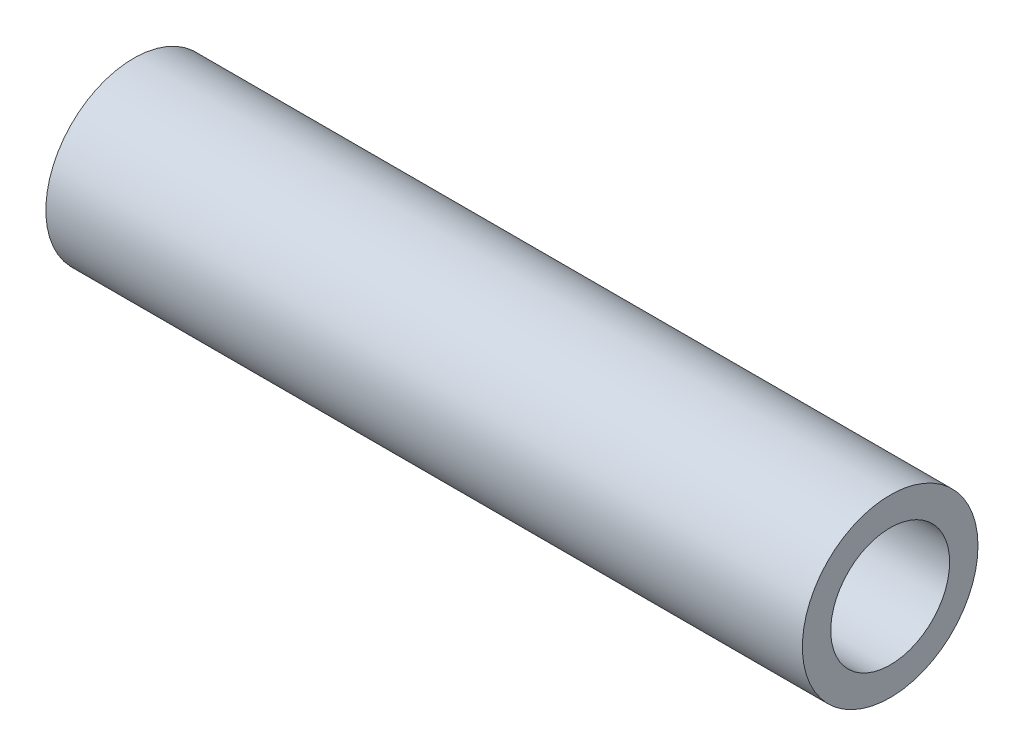
ISO-10303-21;
HEADER;
FILE_DESCRIPTION(('STEP AP214'),'2;1');
FILE_NAME('part.step','',(''),(''),'','','');
FILE_SCHEMA(('AUTOMOTIVE_DESIGN { 1 0 10303 214 1 1 1 1 }'));
ENDSEC;
DATA;
#1=APPLICATION_CONTEXT('core data for automotive mechanical design processes');
#2=APPLICATION_PROTOCOL_DEFINITION('international standard','automotive_design',2000,#1);
#3=PRODUCT_CONTEXT('',#1,'mechanical');
#4=PRODUCT('Part','Part','',(#3));
#5=PRODUCT_RELATED_PRODUCT_CATEGORY('part','',(#4));
#6=PRODUCT_DEFINITION_FORMATION('','',#4);
#7=PRODUCT_DEFINITION_CONTEXT('part definition',#1,'design');
#8=PRODUCT_DEFINITION('design','',#6,#7);
#9=PRODUCT_DEFINITION_SHAPE('','',#8);
#10=(LENGTH_UNIT() NAMED_UNIT(*) SI_UNIT(.MILLI.,.METRE.));
#11=(NAMED_UNIT(*) PLANE_ANGLE_UNIT() SI_UNIT($,.RADIAN.));
#12=(NAMED_UNIT(*) SI_UNIT($,.STERADIAN.) SOLID_ANGLE_UNIT());
#13=UNCERTAINTY_MEASURE_WITH_UNIT(LENGTH_MEASURE(1.E-05),#10,'distance_accuracy_value','');
#14=(GEOMETRIC_REPRESENTATION_CONTEXT(3) GLOBAL_UNCERTAINTY_ASSIGNED_CONTEXT((#13)) GLOBAL_UNIT_ASSIGNED_CONTEXT((#10,
#11,#12)) REPRESENTATION_CONTEXT('',''));
#15=CARTESIAN_POINT('',(0.,0.,0.));
#16=DIRECTION('',(0.,0.,1.));
#17=DIRECTION('',(1.,0.,0.));
#18=AXIS2_PLACEMENT_3D('',#15,#16,#17);
#19=CARTESIAN_POINT('',(28.,0.,0.));
#20=DIRECTION('',(1.,0.,0.));
#21=DIRECTION('',(0.,0.,-1.));
#22=AXIS2_PLACEMENT_3D('',#19,#20,#21);
#23=PLANE('',#22);
#24=CARTESIAN_POINT('',(28.,0.,0.));
#25=DIRECTION('',(1.,0.,0.));
#26=DIRECTION('',(0.,0.,-1.));
#27=AXIS2_PLACEMENT_3D('',#24,#25,#26);
#28=CIRCLE('',#27,3.25);
#29=CARTESIAN_POINT('',(28.,0.,-3.25));
#30=VERTEX_POINT('',#29);
#31=EDGE_CURVE('E10',#30,#30,#28,.T.);
#32=ORIENTED_EDGE('',*,*,#31,.T.);
#33=EDGE_LOOP('',(#32));
#34=FACE_BOUND('',#33,.T.);
#35=CARTESIAN_POINT('',(28.,0.,0.));
#36=DIRECTION('',(1.,0.,0.));
#37=DIRECTION('',(0.,0.,-1.));
#38=AXIS2_PLACEMENT_3D('',#35,#36,#37);
#39=CIRCLE('',#38,2.2);
#40=CARTESIAN_POINT('',(28.,0.,-2.2));
#41=VERTEX_POINT('',#40);
#42=EDGE_CURVE('E50',#41,#41,#39,.T.);
#43=ORIENTED_EDGE('',*,*,#42,.F.);
#44=EDGE_LOOP('',(#43));
#45=FACE_BOUND('',#44,.T.);
#46=ADVANCED_FACE('F37',(#34,#45),#23,.T.);
#47=CARTESIAN_POINT('',(0.,0.,0.));
#48=DIRECTION('',(1.,0.,0.));
#49=DIRECTION('',(0.,0.,-1.));
#50=AXIS2_PLACEMENT_3D('',#47,#48,#49);
#51=PLANE('',#50);
#52=CARTESIAN_POINT('',(0.,0.,0.));
#53=DIRECTION('',(1.,0.,0.));
#54=DIRECTION('',(0.,0.,-1.));
#55=AXIS2_PLACEMENT_3D('',#52,#53,#54);
#56=CIRCLE('',#55,3.25);
#57=CARTESIAN_POINT('',(0.,0.,-3.25));
#58=VERTEX_POINT('',#57);
#59=EDGE_CURVE('E41',#58,#58,#56,.T.);
#60=ORIENTED_EDGE('',*,*,#59,.F.);
#61=EDGE_LOOP('',(#60));
#62=FACE_BOUND('',#61,.T.);
#63=CARTESIAN_POINT('',(0.,0.,0.));
#64=DIRECTION('',(1.,0.,0.));
#65=DIRECTION('',(0.,0.,-1.));
#66=AXIS2_PLACEMENT_3D('',#63,#64,#65);
#67=CIRCLE('',#66,2.2);
#68=CARTESIAN_POINT('',(0.,0.,-2.2));
#69=VERTEX_POINT('',#68);
#70=EDGE_CURVE('E52',#69,#69,#67,.T.);
#71=ORIENTED_EDGE('',*,*,#70,.T.);
#72=EDGE_LOOP('',(#71));
#73=FACE_BOUND('',#72,.T.);
#74=ADVANCED_FACE('F64',(#62,#73),#51,.F.);
#75=CARTESIAN_POINT('',(28.,0.,0.));
#76=DIRECTION('',(-1.,0.,0.));
#77=DIRECTION('',(0.,0.,1.));
#78=AXIS2_PLACEMENT_3D('',#75,#76,#77);
#79=CYLINDRICAL_SURFACE('',#78,3.25);
#80=ORIENTED_EDGE('',*,*,#31,.F.);
#81=EDGE_LOOP('',(#80));
#82=FACE_BOUND('',#81,.T.);
#83=ORIENTED_EDGE('',*,*,#59,.T.);
#84=EDGE_LOOP('',(#83));
#85=FACE_BOUND('',#84,.T.);
#86=ADVANCED_FACE('F39',(#82,#85),#79,.T.);
#87=CARTESIAN_POINT('',(28.,0.,0.));
#88=DIRECTION('',(-1.,0.,0.));
#89=DIRECTION('',(0.,0.,1.));
#90=AXIS2_PLACEMENT_3D('',#87,#88,#89);
#91=CYLINDRICAL_SURFACE('',#90,2.2);
#92=ORIENTED_EDGE('',*,*,#42,.T.);
#93=EDGE_LOOP('',(#92));
#94=FACE_BOUND('',#93,.T.);
#95=ORIENTED_EDGE('',*,*,#70,.F.);
#96=EDGE_LOOP('',(#95));
#97=FACE_BOUND('',#96,.T.);
#98=ADVANCED_FACE('F60',(#94,#97),#91,.F.);
#99=CLOSED_SHELL('',(#46,#74,#86,#98));
#100=MANIFOLD_SOLID_BREP('B2',#99);
#101=ADVANCED_BREP_SHAPE_REPRESENTATION('',(#18,#100),#14);
#102=SHAPE_DEFINITION_REPRESENTATION(#9,#101);
ENDSEC;
END-ISO-10303-21;
